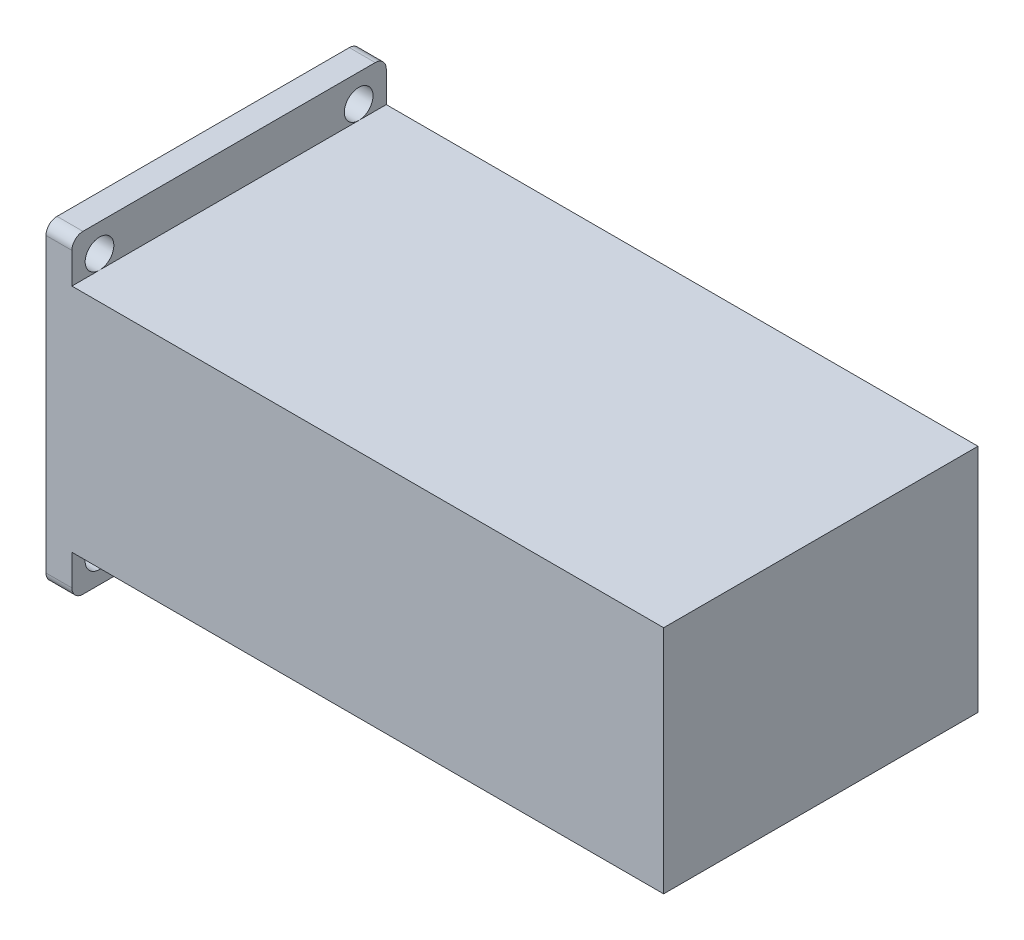
ISO-10303-21;
HEADER;
FILE_DESCRIPTION(('STEP AP214'),'2;1');
FILE_NAME('part.step','',(''),(''),'','','');
FILE_SCHEMA(('AUTOMOTIVE_DESIGN { 1 0 10303 214 1 1 1 1 }'));
ENDSEC;
DATA;
#1=APPLICATION_CONTEXT('core data for automotive mechanical design processes');
#2=APPLICATION_PROTOCOL_DEFINITION('international standard','automotive_design',2000,#1);
#3=PRODUCT_CONTEXT('',#1,'mechanical');
#4=PRODUCT('Part','Part','',(#3));
#5=PRODUCT_RELATED_PRODUCT_CATEGORY('part','',(#4));
#6=PRODUCT_DEFINITION_FORMATION('','',#4);
#7=PRODUCT_DEFINITION_CONTEXT('part definition',#1,'design');
#8=PRODUCT_DEFINITION('design','',#6,#7);
#9=PRODUCT_DEFINITION_SHAPE('','',#8);
#10=(LENGTH_UNIT() NAMED_UNIT(*) SI_UNIT(.MILLI.,.METRE.));
#11=(NAMED_UNIT(*) PLANE_ANGLE_UNIT() SI_UNIT($,.RADIAN.));
#12=(NAMED_UNIT(*) SI_UNIT($,.STERADIAN.) SOLID_ANGLE_UNIT());
#13=UNCERTAINTY_MEASURE_WITH_UNIT(LENGTH_MEASURE(1.E-05),#10,'distance_accuracy_value','');
#14=(GEOMETRIC_REPRESENTATION_CONTEXT(3) GLOBAL_UNCERTAINTY_ASSIGNED_CONTEXT((#13)) GLOBAL_UNIT_ASSIGNED_CONTEXT((#10,
#11,#12)) REPRESENTATION_CONTEXT('',''));
#15=CARTESIAN_POINT('',(0.,0.,0.));
#16=DIRECTION('',(0.,0.,1.));
#17=DIRECTION('',(1.,0.,0.));
#18=AXIS2_PLACEMENT_3D('',#15,#16,#17);
#19=CARTESIAN_POINT('',(112.,-28.5,-28.5));
#20=DIRECTION('',(0.,1.,0.));
#21=DIRECTION('',(0.,0.,1.));
#22=AXIS2_PLACEMENT_3D('',#19,#20,#21);
#23=PLANE('',#22);
#24=DIRECTION('',(0.,0.,-1.));
#25=VECTOR('',#24,1.);
#26=CARTESIAN_POINT('',(4.70000000000001,-28.5,28.5));
#27=LINE('',#26,#25);
#28=CARTESIAN_POINT('',(4.70000000000001,-28.5,26.5));
#29=VERTEX_POINT('',#28);
#30=CARTESIAN_POINT('',(4.70000000000001,-28.5,-26.5));
#31=VERTEX_POINT('',#30);
#32=EDGE_CURVE('E216',#29,#31,#27,.T.);
#33=ORIENTED_EDGE('',*,*,#32,.F.);
#34=DIRECTION('',(-1.,0.,0.));
#35=VECTOR('',#34,1.);
#36=CARTESIAN_POINT('',(112.,-28.5,26.5));
#37=LINE('',#36,#35);
#38=CARTESIAN_POINT('',(0.,-28.5,26.5));
#39=VERTEX_POINT('',#38);
#40=EDGE_CURVE('E283',#29,#39,#37,.T.);
#41=ORIENTED_EDGE('',*,*,#40,.T.);
#42=DIRECTION('',(0.,0.,-1.));
#43=VECTOR('',#42,1.);
#44=CARTESIAN_POINT('',(0.,-28.5,-28.5));
#45=LINE('',#44,#43);
#46=CARTESIAN_POINT('',(0.,-28.5,-26.5));
#47=VERTEX_POINT('',#46);
#48=EDGE_CURVE('E254',#39,#47,#45,.T.);
#49=ORIENTED_EDGE('',*,*,#48,.T.);
#50=DIRECTION('',(-1.,0.,0.));
#51=VECTOR('',#50,1.);
#52=CARTESIAN_POINT('',(112.,-28.5,-26.5));
#53=LINE('',#52,#51);
#54=EDGE_CURVE('E286',#47,#31,#53,.F.);
#55=ORIENTED_EDGE('',*,*,#54,.T.);
#56=EDGE_LOOP('',(#33,#41,#49,#55));
#57=FACE_BOUND('',#56,.T.);
#58=ADVANCED_FACE('F45',(#57),#23,.F.);
#59=CARTESIAN_POINT('',(112.,-26.5,-26.5));
#60=DIRECTION('',(-1.,0.,0.));
#61=DIRECTION('',(0.,0.,1.));
#62=AXIS2_PLACEMENT_3D('',#59,#60,#61);
#63=CYLINDRICAL_SURFACE('',#62,2.);
#64=DIRECTION('',(-1.,0.,0.));
#65=VECTOR('',#64,1.);
#66=CARTESIAN_POINT('',(112.,-26.5,-28.5));
#67=LINE('',#66,#65);
#68=CARTESIAN_POINT('',(4.70000000000001,-26.5,-28.5));
#69=VERTEX_POINT('',#68);
#70=CARTESIAN_POINT('',(0.,-26.5,-28.5));
#71=VERTEX_POINT('',#70);
#72=EDGE_CURVE('E268',#69,#71,#67,.T.);
#73=ORIENTED_EDGE('',*,*,#72,.F.);
#74=CARTESIAN_POINT('',(4.70000000000001,-26.5,-26.5));
#75=DIRECTION('',(1.,0.,0.));
#76=DIRECTION('',(0.,0.,-1.));
#77=AXIS2_PLACEMENT_3D('',#74,#75,#76);
#78=CIRCLE('',#77,2.);
#79=EDGE_CURVE('E236',#69,#31,#78,.F.);
#80=ORIENTED_EDGE('',*,*,#79,.T.);
#81=ORIENTED_EDGE('',*,*,#54,.F.);
#82=CARTESIAN_POINT('',(0.,-26.5,-26.5));
#83=DIRECTION('',(1.,0.,0.));
#84=DIRECTION('',(0.,0.,-1.));
#85=AXIS2_PLACEMENT_3D('',#82,#83,#84);
#86=CIRCLE('',#85,2.);
#87=EDGE_CURVE('E280',#71,#47,#86,.F.);
#88=ORIENTED_EDGE('',*,*,#87,.F.);
#89=EDGE_LOOP('',(#73,#80,#81,#88));
#90=FACE_BOUND('',#89,.T.);
#91=ADVANCED_FACE('F405',(#90),#63,.T.);
#92=CARTESIAN_POINT('',(112.,-26.5,26.5));
#93=DIRECTION('',(-1.,0.,0.));
#94=DIRECTION('',(0.,0.,1.));
#95=AXIS2_PLACEMENT_3D('',#92,#93,#94);
#96=CYLINDRICAL_SURFACE('',#95,2.);
#97=ORIENTED_EDGE('',*,*,#40,.F.);
#98=CARTESIAN_POINT('',(4.70000000000001,-26.5,26.5));
#99=DIRECTION('',(1.,0.,0.));
#100=DIRECTION('',(0.,0.,-1.));
#101=AXIS2_PLACEMENT_3D('',#98,#99,#100);
#102=CIRCLE('',#101,2.);
#103=CARTESIAN_POINT('',(4.70000000000001,-26.5,28.5));
#104=VERTEX_POINT('',#103);
#105=EDGE_CURVE('E169',#29,#104,#102,.F.);
#106=ORIENTED_EDGE('',*,*,#105,.T.);
#107=DIRECTION('',(-1.,0.,0.));
#108=VECTOR('',#107,1.);
#109=CARTESIAN_POINT('',(112.,-26.5,28.5));
#110=LINE('',#109,#108);
#111=CARTESIAN_POINT('',(0.,-26.5,28.5));
#112=VERTEX_POINT('',#111);
#113=EDGE_CURVE('E293',#112,#104,#110,.F.);
#114=ORIENTED_EDGE('',*,*,#113,.F.);
#115=CARTESIAN_POINT('',(0.,-26.5,26.5));
#116=DIRECTION('',(1.,0.,0.));
#117=DIRECTION('',(0.,0.,-1.));
#118=AXIS2_PLACEMENT_3D('',#115,#116,#117);
#119=CIRCLE('',#118,2.);
#120=EDGE_CURVE('E277',#39,#112,#119,.F.);
#121=ORIENTED_EDGE('',*,*,#120,.F.);
#122=EDGE_LOOP('',(#97,#106,#114,#121));
#123=FACE_BOUND('',#122,.T.);
#124=ADVANCED_FACE('F398',(#123),#96,.T.);
#125=CARTESIAN_POINT('',(112.,-28.5,28.5));
#126=DIRECTION('',(0.,0.,-1.));
#127=DIRECTION('',(-1.,0.,0.));
#128=AXIS2_PLACEMENT_3D('',#125,#126,#127);
#129=PLANE('',#128);
#130=DIRECTION('',(0.,-1.,0.));
#131=VECTOR('',#130,1.);
#132=CARTESIAN_POINT('',(112.,-28.5,28.5));
#133=LINE('',#132,#131);
#134=CARTESIAN_POINT('',(112.,20.9,28.5));
#135=VERTEX_POINT('',#134);
#136=CARTESIAN_POINT('',(112.,-20.9,28.5));
#137=VERTEX_POINT('',#136);
#138=EDGE_CURVE('E241',#135,#137,#133,.T.);
#139=ORIENTED_EDGE('',*,*,#138,.F.);
#140=DIRECTION('',(1.,0.,0.));
#141=VECTOR('',#140,1.);
#142=CARTESIAN_POINT('',(4.70000000000001,20.9,28.5));
#143=LINE('',#142,#141);
#144=CARTESIAN_POINT('',(4.70000000000001,20.9,28.5));
#145=VERTEX_POINT('',#144);
#146=EDGE_CURVE('E204',#145,#135,#143,.T.);
#147=ORIENTED_EDGE('',*,*,#146,.F.);
#148=DIRECTION('',(0.,-1.,0.));
#149=VECTOR('',#148,1.);
#150=CARTESIAN_POINT('',(4.70000000000001,28.5,28.5));
#151=LINE('',#150,#149);
#152=CARTESIAN_POINT('',(4.70000000000001,26.5,28.5));
#153=VERTEX_POINT('',#152);
#154=EDGE_CURVE('E188',#153,#145,#151,.T.);
#155=ORIENTED_EDGE('',*,*,#154,.F.);
#156=DIRECTION('',(-1.,0.,0.));
#157=VECTOR('',#156,1.);
#158=CARTESIAN_POINT('',(112.,26.5,28.5));
#159=LINE('',#158,#157);
#160=CARTESIAN_POINT('',(0.,26.5,28.5));
#161=VERTEX_POINT('',#160);
#162=EDGE_CURVE('E290',#153,#161,#159,.T.);
#163=ORIENTED_EDGE('',*,*,#162,.T.);
#164=DIRECTION('',(0.,-1.,0.));
#165=VECTOR('',#164,1.);
#166=CARTESIAN_POINT('',(0.,-28.5,28.5));
#167=LINE('',#166,#165);
#168=EDGE_CURVE('E240',#161,#112,#167,.T.);
#169=ORIENTED_EDGE('',*,*,#168,.T.);
#170=ORIENTED_EDGE('',*,*,#113,.T.);
#171=DIRECTION('',(0.,-1.,0.));
#172=VECTOR('',#171,1.);
#173=CARTESIAN_POINT('',(4.70000000000001,-20.9,28.5));
#174=LINE('',#173,#172);
#175=CARTESIAN_POINT('',(4.70000000000001,-20.9,28.5));
#176=VERTEX_POINT('',#175);
#177=EDGE_CURVE('E223',#176,#104,#174,.T.);
#178=ORIENTED_EDGE('',*,*,#177,.F.);
#179=DIRECTION('',(1.,0.,0.));
#180=VECTOR('',#179,1.);
#181=CARTESIAN_POINT('',(4.70000000000001,-20.9,28.5));
#182=LINE('',#181,#180);
#183=EDGE_CURVE('E179',#176,#137,#182,.T.);
#184=ORIENTED_EDGE('',*,*,#183,.T.);
#185=EDGE_LOOP('',(#139,#147,#155,#163,#169,#170,#178,#184));
#186=FACE_BOUND('',#185,.T.);
#187=ADVANCED_FACE('F384',(#186),#129,.F.);
#188=CARTESIAN_POINT('',(112.,-28.5,-28.5));
#189=DIRECTION('',(0.,0.,1.));
#190=DIRECTION('',(1.,0.,0.));
#191=AXIS2_PLACEMENT_3D('',#188,#189,#190);
#192=PLANE('',#191);
#193=DIRECTION('',(0.,1.,0.));
#194=VECTOR('',#193,1.);
#195=CARTESIAN_POINT('',(4.70000000000001,28.5,-28.5));
#196=LINE('',#195,#194);
#197=CARTESIAN_POINT('',(4.70000000000001,20.9,-28.5));
#198=VERTEX_POINT('',#197);
#199=CARTESIAN_POINT('',(4.70000000000001,26.5,-28.5));
#200=VERTEX_POINT('',#199);
#201=EDGE_CURVE('E197',#198,#200,#196,.T.);
#202=ORIENTED_EDGE('',*,*,#201,.F.);
#203=DIRECTION('',(1.,0.,0.));
#204=VECTOR('',#203,1.);
#205=CARTESIAN_POINT('',(4.70000000000001,20.9,-28.5));
#206=LINE('',#205,#204);
#207=CARTESIAN_POINT('',(112.,20.9,-28.5));
#208=VERTEX_POINT('',#207);
#209=EDGE_CURVE('E208',#198,#208,#206,.T.);
#210=ORIENTED_EDGE('',*,*,#209,.T.);
#211=DIRECTION('',(0.,1.,0.));
#212=VECTOR('',#211,1.);
#213=CARTESIAN_POINT('',(112.,-28.5,-28.5));
#214=LINE('',#213,#212);
#215=CARTESIAN_POINT('',(112.,-20.9,-28.5));
#216=VERTEX_POINT('',#215);
#217=EDGE_CURVE('E245',#216,#208,#214,.T.);
#218=ORIENTED_EDGE('',*,*,#217,.F.);
#219=DIRECTION('',(1.,0.,0.));
#220=VECTOR('',#219,1.);
#221=CARTESIAN_POINT('',(4.70000000000001,-20.9,-28.5));
#222=LINE('',#221,#220);
#223=CARTESIAN_POINT('',(4.70000000000001,-20.9,-28.5));
#224=VERTEX_POINT('',#223);
#225=EDGE_CURVE('E184',#224,#216,#222,.T.);
#226=ORIENTED_EDGE('',*,*,#225,.F.);
#227=DIRECTION('',(0.,1.,0.));
#228=VECTOR('',#227,1.);
#229=CARTESIAN_POINT('',(4.70000000000001,-20.9,-28.5));
#230=LINE('',#229,#228);
#231=EDGE_CURVE('E220',#69,#224,#230,.T.);
#232=ORIENTED_EDGE('',*,*,#231,.F.);
#233=ORIENTED_EDGE('',*,*,#72,.T.);
#234=DIRECTION('',(0.,1.,0.));
#235=VECTOR('',#234,1.);
#236=CARTESIAN_POINT('',(0.,-28.5,-28.5));
#237=LINE('',#236,#235);
#238=CARTESIAN_POINT('',(0.,26.5,-28.5));
#239=VERTEX_POINT('',#238);
#240=EDGE_CURVE('E258',#71,#239,#237,.T.);
#241=ORIENTED_EDGE('',*,*,#240,.T.);
#242=DIRECTION('',(-1.,0.,0.));
#243=VECTOR('',#242,1.);
#244=CARTESIAN_POINT('',(112.,26.5,-28.5));
#245=LINE('',#244,#243);
#246=EDGE_CURVE('E250',#239,#200,#245,.F.);
#247=ORIENTED_EDGE('',*,*,#246,.T.);
#248=EDGE_LOOP('',(#202,#210,#218,#226,#232,#233,#241,#247));
#249=FACE_BOUND('',#248,.T.);
#250=ADVANCED_FACE('F410',(#249),#192,.F.);
#251=CARTESIAN_POINT('',(112.,28.5,-28.5));
#252=DIRECTION('',(0.,-1.,0.));
#253=DIRECTION('',(0.,0.,-1.));
#254=AXIS2_PLACEMENT_3D('',#251,#252,#253);
#255=PLANE('',#254);
#256=DIRECTION('',(-1.,0.,0.));
#257=VECTOR('',#256,1.);
#258=CARTESIAN_POINT('',(112.,28.5,26.5));
#259=LINE('',#258,#257);
#260=CARTESIAN_POINT('',(0.,28.5,26.5));
#261=VERTEX_POINT('',#260);
#262=CARTESIAN_POINT('',(4.70000000000001,28.5,26.5));
#263=VERTEX_POINT('',#262);
#264=EDGE_CURVE('E297',#261,#263,#259,.F.);
#265=ORIENTED_EDGE('',*,*,#264,.T.);
#266=DIRECTION('',(0.,0.,1.));
#267=VECTOR('',#266,1.);
#268=CARTESIAN_POINT('',(4.70000000000001,28.5,28.5));
#269=LINE('',#268,#267);
#270=CARTESIAN_POINT('',(4.70000000000001,28.5,-26.5));
#271=VERTEX_POINT('',#270);
#272=EDGE_CURVE('E201',#271,#263,#269,.T.);
#273=ORIENTED_EDGE('',*,*,#272,.F.);
#274=DIRECTION('',(-1.,0.,0.));
#275=VECTOR('',#274,1.);
#276=CARTESIAN_POINT('',(112.,28.5,-26.5));
#277=LINE('',#276,#275);
#278=CARTESIAN_POINT('',(0.,28.5,-26.5));
#279=VERTEX_POINT('',#278);
#280=EDGE_CURVE('E301',#271,#279,#277,.T.);
#281=ORIENTED_EDGE('',*,*,#280,.T.);
#282=DIRECTION('',(0.,0.,1.));
#283=VECTOR('',#282,1.);
#284=CARTESIAN_POINT('',(0.,28.5,-28.5));
#285=LINE('',#284,#283);
#286=EDGE_CURVE('E246',#279,#261,#285,.T.);
#287=ORIENTED_EDGE('',*,*,#286,.T.);
#288=EDGE_LOOP('',(#265,#273,#281,#287));
#289=FACE_BOUND('',#288,.T.);
#290=ADVANCED_FACE('F424',(#289),#255,.F.);
#291=CARTESIAN_POINT('',(112.,0.,0.));
#292=DIRECTION('',(1.,0.,0.));
#293=DIRECTION('',(0.,0.,-1.));
#294=AXIS2_PLACEMENT_3D('',#291,#292,#293);
#295=PLANE('',#294);
#296=DIRECTION('',(0.,0.,-1.));
#297=VECTOR('',#296,1.);
#298=CARTESIAN_POINT('',(112.,20.9,-20.9));
#299=LINE('',#298,#297);
#300=EDGE_CURVE('E192',#135,#208,#299,.T.);
#301=ORIENTED_EDGE('',*,*,#300,.F.);
#302=ORIENTED_EDGE('',*,*,#138,.T.);
#303=DIRECTION('',(0.,0.,1.));
#304=VECTOR('',#303,1.);
#305=CARTESIAN_POINT('',(112.,-20.9,28.5));
#306=LINE('',#305,#304);
#307=EDGE_CURVE('E207',#216,#137,#306,.T.);
#308=ORIENTED_EDGE('',*,*,#307,.F.);
#309=ORIENTED_EDGE('',*,*,#217,.T.);
#310=EDGE_LOOP('',(#301,#302,#308,#309));
#311=FACE_BOUND('',#310,.T.);
#312=ADVANCED_FACE('F415',(#311),#295,.T.);
#313=CARTESIAN_POINT('',(0.,0.,0.));
#314=DIRECTION('',(1.,0.,0.));
#315=DIRECTION('',(0.,0.,-1.));
#316=AXIS2_PLACEMENT_3D('',#313,#314,#315);
#317=PLANE('',#316);
#318=CARTESIAN_POINT('',(0.,23.5,23.5));
#319=DIRECTION('',(-1.,0.,0.));
#320=DIRECTION('',(0.,0.,1.));
#321=AXIS2_PLACEMENT_3D('',#318,#319,#320);
#322=CIRCLE('',#321,2.6);
#323=CARTESIAN_POINT('',(0.,23.5,26.1));
#324=VERTEX_POINT('',#323);
#325=EDGE_CURVE('E331',#324,#324,#322,.T.);
#326=ORIENTED_EDGE('',*,*,#325,.F.);
#327=EDGE_LOOP('',(#326));
#328=FACE_BOUND('',#327,.T.);
#329=CARTESIAN_POINT('',(0.,-23.5,-23.5));
#330=DIRECTION('',(-1.,0.,0.));
#331=DIRECTION('',(0.,0.,1.));
#332=AXIS2_PLACEMENT_3D('',#329,#330,#331);
#333=CIRCLE('',#332,2.6);
#334=CARTESIAN_POINT('',(0.,-23.5,-20.9));
#335=VERTEX_POINT('',#334);
#336=EDGE_CURVE('E332',#335,#335,#333,.T.);
#337=ORIENTED_EDGE('',*,*,#336,.F.);
#338=EDGE_LOOP('',(#337));
#339=FACE_BOUND('',#338,.T.);
#340=CARTESIAN_POINT('',(0.,-23.5,23.5));
#341=DIRECTION('',(-1.,0.,0.));
#342=DIRECTION('',(0.,0.,1.));
#343=AXIS2_PLACEMENT_3D('',#340,#341,#342);
#344=CIRCLE('',#343,2.6);
#345=CARTESIAN_POINT('',(0.,-23.5,26.1));
#346=VERTEX_POINT('',#345);
#347=EDGE_CURVE('E339',#346,#346,#344,.T.);
#348=ORIENTED_EDGE('',*,*,#347,.F.);
#349=EDGE_LOOP('',(#348));
#350=FACE_BOUND('',#349,.T.);
#351=CARTESIAN_POINT('',(0.,23.5,-23.5));
#352=DIRECTION('',(-1.,0.,0.));
#353=DIRECTION('',(0.,0.,1.));
#354=AXIS2_PLACEMENT_3D('',#351,#352,#353);
#355=CIRCLE('',#354,2.6);
#356=CARTESIAN_POINT('',(0.,23.5,-20.9));
#357=VERTEX_POINT('',#356);
#358=EDGE_CURVE('E325',#357,#357,#355,.T.);
#359=ORIENTED_EDGE('',*,*,#358,.F.);
#360=EDGE_LOOP('',(#359));
#361=FACE_BOUND('',#360,.T.);
#362=CARTESIAN_POINT('',(0.,0.,0.));
#363=DIRECTION('',(1.,0.,0.));
#364=DIRECTION('',(0.,0.,-1.));
#365=AXIS2_PLACEMENT_3D('',#362,#363,#364);
#366=CIRCLE('',#365,19.05);
#367=CARTESIAN_POINT('',(0.,0.,-19.05));
#368=VERTEX_POINT('',#367);
#369=EDGE_CURVE('E11',#368,#368,#366,.F.);
#370=ORIENTED_EDGE('',*,*,#369,.F.);
#371=EDGE_LOOP('',(#370));
#372=FACE_BOUND('',#371,.T.);
#373=ORIENTED_EDGE('',*,*,#240,.F.);
#374=ORIENTED_EDGE('',*,*,#87,.T.);
#375=ORIENTED_EDGE('',*,*,#48,.F.);
#376=ORIENTED_EDGE('',*,*,#120,.T.);
#377=ORIENTED_EDGE('',*,*,#168,.F.);
#378=CARTESIAN_POINT('',(0.,26.5,26.5));
#379=DIRECTION('',(1.,0.,0.));
#380=DIRECTION('',(0.,0.,-1.));
#381=AXIS2_PLACEMENT_3D('',#378,#379,#380);
#382=CIRCLE('',#381,2.);
#383=EDGE_CURVE('E271',#161,#261,#382,.F.);
#384=ORIENTED_EDGE('',*,*,#383,.T.);
#385=ORIENTED_EDGE('',*,*,#286,.F.);
#386=CARTESIAN_POINT('',(0.,26.5,-26.5));
#387=DIRECTION('',(1.,0.,0.));
#388=DIRECTION('',(0.,0.,-1.));
#389=AXIS2_PLACEMENT_3D('',#386,#387,#388);
#390=CIRCLE('',#389,2.);
#391=EDGE_CURVE('E274',#279,#239,#390,.F.);
#392=ORIENTED_EDGE('',*,*,#391,.T.);
#393=EDGE_LOOP('',(#373,#374,#375,#376,#377,#384,#385,#392));
#394=FACE_BOUND('',#393,.T.);
#395=ADVANCED_FACE('F392',(#328,#339,#350,#361,#372,#394),#317,.F.);
#396=CARTESIAN_POINT('',(112.,26.5,-26.5));
#397=DIRECTION('',(-1.,0.,0.));
#398=DIRECTION('',(0.,0.,1.));
#399=AXIS2_PLACEMENT_3D('',#396,#397,#398);
#400=CYLINDRICAL_SURFACE('',#399,2.);
#401=CARTESIAN_POINT('',(4.70000000000001,26.5,-26.5));
#402=DIRECTION('',(-1.,0.,0.));
#403=DIRECTION('',(0.,0.,1.));
#404=AXIS2_PLACEMENT_3D('',#401,#402,#403);
#405=CIRCLE('',#404,2.);
#406=EDGE_CURVE('E212',#200,#271,#405,.F.);
#407=ORIENTED_EDGE('',*,*,#406,.F.);
#408=ORIENTED_EDGE('',*,*,#246,.F.);
#409=ORIENTED_EDGE('',*,*,#391,.F.);
#410=ORIENTED_EDGE('',*,*,#280,.F.);
#411=EDGE_LOOP('',(#407,#408,#409,#410));
#412=FACE_BOUND('',#411,.T.);
#413=ADVANCED_FACE('F421',(#412),#400,.T.);
#414=CARTESIAN_POINT('',(112.,26.5,26.5));
#415=DIRECTION('',(-1.,0.,0.));
#416=DIRECTION('',(0.,0.,1.));
#417=AXIS2_PLACEMENT_3D('',#414,#415,#416);
#418=CYLINDRICAL_SURFACE('',#417,2.);
#419=CARTESIAN_POINT('',(4.70000000000001,26.5,26.5));
#420=DIRECTION('',(-1.,0.,0.));
#421=DIRECTION('',(0.,0.,1.));
#422=AXIS2_PLACEMENT_3D('',#419,#420,#421);
#423=CIRCLE('',#422,2.);
#424=EDGE_CURVE('E304',#263,#153,#423,.F.);
#425=ORIENTED_EDGE('',*,*,#424,.F.);
#426=ORIENTED_EDGE('',*,*,#264,.F.);
#427=ORIENTED_EDGE('',*,*,#383,.F.);
#428=ORIENTED_EDGE('',*,*,#162,.F.);
#429=EDGE_LOOP('',(#425,#426,#427,#428));
#430=FACE_BOUND('',#429,.T.);
#431=ADVANCED_FACE('F47',(#430),#418,.T.);
#432=CARTESIAN_POINT('',(4.70000000000001,20.9,-20.9));
#433=DIRECTION('',(0.,-1.,0.));
#434=DIRECTION('',(0.,0.,-1.));
#435=AXIS2_PLACEMENT_3D('',#432,#433,#434);
#436=PLANE('',#435);
#437=ORIENTED_EDGE('',*,*,#300,.T.);
#438=ORIENTED_EDGE('',*,*,#209,.F.);
#439=DIRECTION('',(0.,0.,-1.));
#440=VECTOR('',#439,1.);
#441=CARTESIAN_POINT('',(4.70000000000001,20.9,20.9));
#442=LINE('',#441,#440);
#443=CARTESIAN_POINT('',(4.70000000000001,20.9,-23.5));
#444=VERTEX_POINT('',#443);
#445=EDGE_CURVE('E191',#444,#198,#442,.T.);
#446=ORIENTED_EDGE('',*,*,#445,.F.);
#447=CARTESIAN_POINT('',(4.70000000000001,20.9,23.5));
#448=VERTEX_POINT('',#447);
#449=EDGE_CURVE('E198',#448,#444,#442,.T.);
#450=ORIENTED_EDGE('',*,*,#449,.F.);
#451=EDGE_CURVE('E193',#145,#448,#442,.T.);
#452=ORIENTED_EDGE('',*,*,#451,.F.);
#453=ORIENTED_EDGE('',*,*,#146,.T.);
#454=EDGE_LOOP('',(#437,#438,#446,#450,#452,#453));
#455=FACE_BOUND('',#454,.T.);
#456=ADVANCED_FACE('F376',(#455),#436,.F.);
#457=CARTESIAN_POINT('',(4.70000000000001,0.,0.));
#458=DIRECTION('',(-1.,0.,0.));
#459=DIRECTION('',(0.,0.,1.));
#460=AXIS2_PLACEMENT_3D('',#457,#458,#459);
#461=PLANE('',#460);
#462=ORIENTED_EDGE('',*,*,#451,.T.);
#463=CARTESIAN_POINT('',(4.70000000000001,23.5,23.5));
#464=DIRECTION('',(-1.,0.,0.));
#465=DIRECTION('',(0.,0.,1.));
#466=AXIS2_PLACEMENT_3D('',#463,#464,#465);
#467=CIRCLE('',#466,2.6);
#468=EDGE_CURVE('E64',#448,#448,#467,.F.);
#469=ORIENTED_EDGE('',*,*,#468,.F.);
#470=ORIENTED_EDGE('',*,*,#449,.T.);
#471=CARTESIAN_POINT('',(4.70000000000001,23.5,-23.5));
#472=DIRECTION('',(-1.,0.,0.));
#473=DIRECTION('',(0.,0.,1.));
#474=AXIS2_PLACEMENT_3D('',#471,#472,#473);
#475=CIRCLE('',#474,2.6);
#476=EDGE_CURVE('E59',#444,#444,#475,.F.);
#477=ORIENTED_EDGE('',*,*,#476,.F.);
#478=ORIENTED_EDGE('',*,*,#445,.T.);
#479=ORIENTED_EDGE('',*,*,#201,.T.);
#480=ORIENTED_EDGE('',*,*,#406,.T.);
#481=ORIENTED_EDGE('',*,*,#272,.T.);
#482=ORIENTED_EDGE('',*,*,#424,.T.);
#483=ORIENTED_EDGE('',*,*,#154,.T.);
#484=EDGE_LOOP('',(#462,#469,#470,#477,#478,#479,#480,#481,#482,#483));
#485=FACE_BOUND('',#484,.T.);
#486=ADVANCED_FACE('F372',(#485),#461,.F.);
#487=CARTESIAN_POINT('',(4.70000000000001,-20.9,28.5));
#488=DIRECTION('',(0.,1.,0.));
#489=DIRECTION('',(0.,0.,1.));
#490=AXIS2_PLACEMENT_3D('',#487,#488,#489);
#491=PLANE('',#490);
#492=ORIENTED_EDGE('',*,*,#307,.T.);
#493=ORIENTED_EDGE('',*,*,#183,.F.);
#494=DIRECTION('',(0.,0.,1.));
#495=VECTOR('',#494,1.);
#496=CARTESIAN_POINT('',(4.70000000000001,-20.9,-20.9));
#497=LINE('',#496,#495);
#498=CARTESIAN_POINT('',(4.70000000000001,-20.9,23.5));
#499=VERTEX_POINT('',#498);
#500=EDGE_CURVE('E226',#499,#176,#497,.T.);
#501=ORIENTED_EDGE('',*,*,#500,.F.);
#502=CARTESIAN_POINT('',(4.70000000000001,-20.9,-23.5));
#503=VERTEX_POINT('',#502);
#504=EDGE_CURVE('E231',#503,#499,#497,.T.);
#505=ORIENTED_EDGE('',*,*,#504,.F.);
#506=EDGE_CURVE('E227',#224,#503,#497,.T.);
#507=ORIENTED_EDGE('',*,*,#506,.F.);
#508=ORIENTED_EDGE('',*,*,#225,.T.);
#509=EDGE_LOOP('',(#492,#493,#501,#505,#507,#508));
#510=FACE_BOUND('',#509,.T.);
#511=ADVANCED_FACE('F362',(#510),#491,.F.);
#512=CARTESIAN_POINT('',(4.70000000000001,0.,0.));
#513=DIRECTION('',(1.,0.,0.));
#514=DIRECTION('',(0.,0.,-1.));
#515=AXIS2_PLACEMENT_3D('',#512,#513,#514);
#516=PLANE('',#515);
#517=ORIENTED_EDGE('',*,*,#506,.T.);
#518=CARTESIAN_POINT('',(4.70000000000001,-23.5,-23.5));
#519=DIRECTION('',(-1.,0.,0.));
#520=DIRECTION('',(0.,0.,1.));
#521=AXIS2_PLACEMENT_3D('',#518,#519,#520);
#522=CIRCLE('',#521,2.6);
#523=EDGE_CURVE('E336',#503,#503,#522,.F.);
#524=ORIENTED_EDGE('',*,*,#523,.F.);
#525=ORIENTED_EDGE('',*,*,#504,.T.);
#526=CARTESIAN_POINT('',(4.70000000000001,-23.5,23.5));
#527=DIRECTION('',(-1.,0.,0.));
#528=DIRECTION('',(0.,0.,1.));
#529=AXIS2_PLACEMENT_3D('',#526,#527,#528);
#530=CIRCLE('',#529,2.6);
#531=EDGE_CURVE('E348',#499,#499,#530,.F.);
#532=ORIENTED_EDGE('',*,*,#531,.F.);
#533=ORIENTED_EDGE('',*,*,#500,.T.);
#534=ORIENTED_EDGE('',*,*,#177,.T.);
#535=ORIENTED_EDGE('',*,*,#105,.F.);
#536=ORIENTED_EDGE('',*,*,#32,.T.);
#537=ORIENTED_EDGE('',*,*,#79,.F.);
#538=ORIENTED_EDGE('',*,*,#231,.T.);
#539=EDGE_LOOP('',(#517,#524,#525,#532,#533,#534,#535,#536,#537,#538));
#540=FACE_BOUND('',#539,.T.);
#541=ADVANCED_FACE('F357',(#540),#516,.T.);
#542=CARTESIAN_POINT('',(-1.5,0.,0.));
#543=DIRECTION('',(1.,0.,0.));
#544=DIRECTION('',(0.,0.,-1.));
#545=AXIS2_PLACEMENT_3D('',#542,#543,#544);
#546=CYLINDRICAL_SURFACE('',#545,19.05);
#547=CARTESIAN_POINT('',(-1.5,0.,0.));
#548=DIRECTION('',(-1.,0.,0.));
#549=DIRECTION('',(0.,0.,1.));
#550=AXIS2_PLACEMENT_3D('',#547,#548,#549);
#551=CIRCLE('',#550,19.05);
#552=CARTESIAN_POINT('',(-1.5,0.,19.05));
#553=VERTEX_POINT('',#552);
#554=EDGE_CURVE('E314',#553,#553,#551,.T.);
#555=ORIENTED_EDGE('',*,*,#554,.F.);
#556=EDGE_LOOP('',(#555));
#557=FACE_BOUND('',#556,.T.);
#558=ORIENTED_EDGE('',*,*,#369,.T.);
#559=EDGE_LOOP('',(#558));
#560=FACE_BOUND('',#559,.T.);
#561=ADVANCED_FACE('F457',(#557,#560),#546,.T.);
#562=CARTESIAN_POINT('',(-1.5,0.,0.));
#563=DIRECTION('',(-1.,0.,0.));
#564=DIRECTION('',(0.,0.,1.));
#565=AXIS2_PLACEMENT_3D('',#562,#563,#564);
#566=PLANE('',#565);
#567=CARTESIAN_POINT('',(-1.5,0.,0.));
#568=DIRECTION('',(-1.,0.,0.));
#569=DIRECTION('',(0.,0.,1.));
#570=AXIS2_PLACEMENT_3D('',#567,#568,#569);
#571=CIRCLE('',#570,4.);
#572=CARTESIAN_POINT('',(-1.5,0.,4.));
#573=VERTEX_POINT('',#572);
#574=EDGE_CURVE('E311',#573,#573,#571,.T.);
#575=ORIENTED_EDGE('',*,*,#574,.F.);
#576=EDGE_LOOP('',(#575));
#577=FACE_BOUND('',#576,.T.);
#578=ORIENTED_EDGE('',*,*,#554,.T.);
#579=EDGE_LOOP('',(#578));
#580=FACE_BOUND('',#579,.T.);
#581=ADVANCED_FACE('F473',(#577,#580),#566,.T.);
#582=CARTESIAN_POINT('',(-5.,0.,0.));
#583=DIRECTION('',(-1.,0.,0.));
#584=DIRECTION('',(0.,0.,1.));
#585=AXIS2_PLACEMENT_3D('',#582,#583,#584);
#586=PLANE('',#585);
#587=DIRECTION('',(0.,0.,1.));
#588=VECTOR('',#587,1.);
#589=CARTESIAN_POINT('',(-5.,3.5,-4.65900590343665));
#590=LINE('',#589,#588);
#591=CARTESIAN_POINT('',(-5.,3.5,-1.93649167310371));
#592=VERTEX_POINT('',#591);
#593=CARTESIAN_POINT('',(-5.,3.5,1.93649167310371));
#594=VERTEX_POINT('',#593);
#595=EDGE_CURVE('E175',#592,#594,#590,.T.);
#596=ORIENTED_EDGE('',*,*,#595,.T.);
#597=CARTESIAN_POINT('',(-5.,0.,0.));
#598=DIRECTION('',(-1.,0.,0.));
#599=DIRECTION('',(0.,0.,1.));
#600=AXIS2_PLACEMENT_3D('',#597,#598,#599);
#601=CIRCLE('',#600,4.);
#602=EDGE_CURVE('E54',#594,#592,#601,.T.);
#603=ORIENTED_EDGE('',*,*,#602,.T.);
#604=EDGE_LOOP('',(#596,#603));
#605=FACE_BOUND('',#604,.T.);
#606=ADVANCED_FACE('F470',(#605),#586,.T.);
#607=CARTESIAN_POINT('',(-5.,3.5,-4.65900590343665));
#608=DIRECTION('',(0.,-1.,0.));
#609=DIRECTION('',(0.,0.,-1.));
#610=AXIS2_PLACEMENT_3D('',#607,#608,#609);
#611=PLANE('',#610);
#612=DIRECTION('',(0.,0.,1.));
#613=VECTOR('',#612,1.);
#614=CARTESIAN_POINT('',(-20.,3.5,0.));
#615=LINE('',#614,#613);
#616=CARTESIAN_POINT('',(-20.,3.5,-1.93649167310371));
#617=VERTEX_POINT('',#616);
#618=CARTESIAN_POINT('',(-20.,3.5,1.93649167310371));
#619=VERTEX_POINT('',#618);
#620=EDGE_CURVE('E157',#617,#619,#615,.T.);
#621=ORIENTED_EDGE('',*,*,#620,.T.);
#622=DIRECTION('',(1.,0.,0.));
#623=VECTOR('',#622,1.);
#624=CARTESIAN_POINT('',(-20.,3.5,1.93649167310371));
#625=LINE('',#624,#623);
#626=EDGE_CURVE('E161',#594,#619,#625,.F.);
#627=ORIENTED_EDGE('',*,*,#626,.F.);
#628=ORIENTED_EDGE('',*,*,#595,.F.);
#629=DIRECTION('',(1.,0.,0.));
#630=VECTOR('',#629,1.);
#631=CARTESIAN_POINT('',(-20.,3.5,-1.93649167310371));
#632=LINE('',#631,#630);
#633=EDGE_CURVE('E164',#617,#592,#632,.T.);
#634=ORIENTED_EDGE('',*,*,#633,.F.);
#635=EDGE_LOOP('',(#621,#627,#628,#634));
#636=FACE_BOUND('',#635,.T.);
#637=ADVANCED_FACE('F159',(#636),#611,.F.);
#638=CARTESIAN_POINT('',(-20.,0.,0.));
#639=DIRECTION('',(-1.,0.,0.));
#640=DIRECTION('',(0.,0.,1.));
#641=AXIS2_PLACEMENT_3D('',#638,#639,#640);
#642=PLANE('',#641);
#643=ORIENTED_EDGE('',*,*,#620,.F.);
#644=CARTESIAN_POINT('',(-20.,0.,0.));
#645=DIRECTION('',(-1.,0.,0.));
#646=DIRECTION('',(0.,0.,1.));
#647=AXIS2_PLACEMENT_3D('',#644,#645,#646);
#648=CIRCLE('',#647,4.);
#649=EDGE_CURVE('E173',#617,#619,#648,.T.);
#650=ORIENTED_EDGE('',*,*,#649,.T.);
#651=EDGE_LOOP('',(#643,#650));
#652=FACE_BOUND('',#651,.T.);
#653=ADVANCED_FACE('F177',(#652),#642,.T.);
#654=CARTESIAN_POINT('',(-20.,0.,0.));
#655=DIRECTION('',(1.,0.,0.));
#656=DIRECTION('',(0.,0.,-1.));
#657=AXIS2_PLACEMENT_3D('',#654,#655,#656);
#658=CYLINDRICAL_SURFACE('',#657,4.);
#659=ORIENTED_EDGE('',*,*,#574,.T.);
#660=EDGE_LOOP('',(#659));
#661=FACE_BOUND('',#660,.T.);
#662=ORIENTED_EDGE('',*,*,#649,.F.);
#663=ORIENTED_EDGE('',*,*,#633,.T.);
#664=ORIENTED_EDGE('',*,*,#602,.F.);
#665=ORIENTED_EDGE('',*,*,#626,.T.);
#666=EDGE_LOOP('',(#662,#663,#664,#665));
#667=FACE_BOUND('',#666,.T.);
#668=ADVANCED_FACE('F172',(#661,#667),#658,.T.);
#669=CARTESIAN_POINT('',(12.0539105243401,-23.5,23.5));
#670=DIRECTION('',(-1.,0.,0.));
#671=DIRECTION('',(0.,0.,1.));
#672=AXIS2_PLACEMENT_3D('',#669,#670,#671);
#673=CYLINDRICAL_SURFACE('',#672,2.6);
#674=ORIENTED_EDGE('',*,*,#531,.T.);
#675=EDGE_LOOP('',(#674));
#676=FACE_BOUND('',#675,.T.);
#677=ORIENTED_EDGE('',*,*,#347,.T.);
#678=EDGE_LOOP('',(#677));
#679=FACE_BOUND('',#678,.T.);
#680=ADVANCED_FACE('F352',(#676,#679),#673,.F.);
#681=CARTESIAN_POINT('',(12.0539105243401,-23.5,-23.5));
#682=DIRECTION('',(-1.,0.,0.));
#683=DIRECTION('',(0.,0.,1.));
#684=AXIS2_PLACEMENT_3D('',#681,#682,#683);
#685=CYLINDRICAL_SURFACE('',#684,2.6);
#686=ORIENTED_EDGE('',*,*,#523,.T.);
#687=EDGE_LOOP('',(#686));
#688=FACE_BOUND('',#687,.T.);
#689=ORIENTED_EDGE('',*,*,#336,.T.);
#690=EDGE_LOOP('',(#689));
#691=FACE_BOUND('',#690,.T.);
#692=ADVANCED_FACE('F485',(#688,#691),#685,.F.);
#693=CARTESIAN_POINT('',(12.0539105243401,23.5,-23.5));
#694=DIRECTION('',(-1.,0.,0.));
#695=DIRECTION('',(0.,0.,1.));
#696=AXIS2_PLACEMENT_3D('',#693,#694,#695);
#697=CYLINDRICAL_SURFACE('',#696,2.6);
#698=ORIENTED_EDGE('',*,*,#476,.T.);
#699=EDGE_LOOP('',(#698));
#700=FACE_BOUND('',#699,.T.);
#701=ORIENTED_EDGE('',*,*,#358,.T.);
#702=EDGE_LOOP('',(#701));
#703=FACE_BOUND('',#702,.T.);
#704=ADVANCED_FACE('F481',(#700,#703),#697,.F.);
#705=CARTESIAN_POINT('',(12.0539105243401,23.5,23.5));
#706=DIRECTION('',(-1.,0.,0.));
#707=DIRECTION('',(0.,0.,1.));
#708=AXIS2_PLACEMENT_3D('',#705,#706,#707);
#709=CYLINDRICAL_SURFACE('',#708,2.6);
#710=ORIENTED_EDGE('',*,*,#468,.T.);
#711=EDGE_LOOP('',(#710));
#712=FACE_BOUND('',#711,.T.);
#713=ORIENTED_EDGE('',*,*,#325,.T.);
#714=EDGE_LOOP('',(#713));
#715=FACE_BOUND('',#714,.T.);
#716=ADVANCED_FACE('F484',(#712,#715),#709,.F.);
#717=CLOSED_SHELL('',(#58,#91,#124,#187,#250,#290,#312,#395,#413,#431,#456,#486,#511,#541,#561,
#581,#606,#637,#653,#668,#680,#692,#704,#716));
#718=MANIFOLD_SOLID_BREP('B2',#717);
#719=ADVANCED_BREP_SHAPE_REPRESENTATION('',(#18,#718),#14);
#720=SHAPE_DEFINITION_REPRESENTATION(#9,#719);
ENDSEC;
END-ISO-10303-21;
